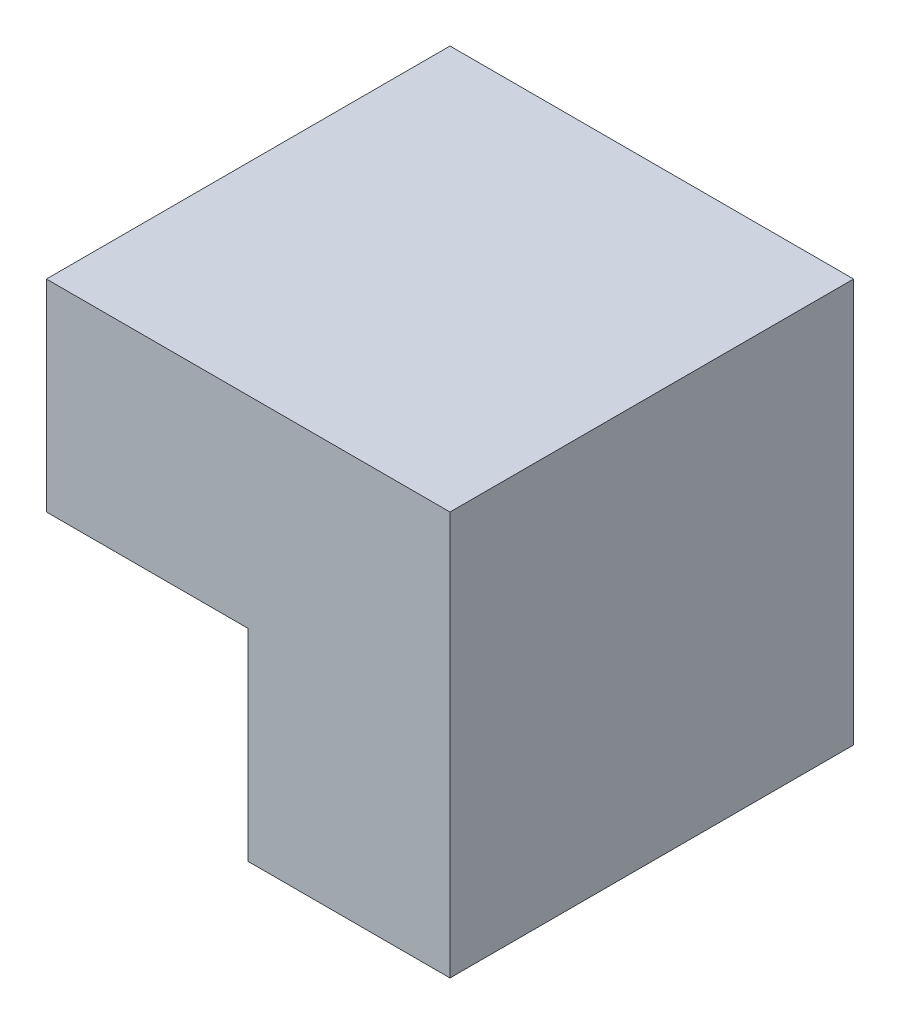
ISO-10303-21;
HEADER;
FILE_DESCRIPTION(('STEP AP214'),'2;1');
FILE_NAME('part.step','',(''),(''),'','','');
FILE_SCHEMA(('AUTOMOTIVE_DESIGN { 1 0 10303 214 1 1 1 1 }'));
ENDSEC;
DATA;
#1=APPLICATION_CONTEXT('core data for automotive mechanical design processes');
#2=APPLICATION_PROTOCOL_DEFINITION('international standard','automotive_design',2000,#1);
#3=PRODUCT_CONTEXT('',#1,'mechanical');
#4=PRODUCT('Part','Part','',(#3));
#5=PRODUCT_RELATED_PRODUCT_CATEGORY('part','',(#4));
#6=PRODUCT_DEFINITION_FORMATION('','',#4);
#7=PRODUCT_DEFINITION_CONTEXT('part definition',#1,'design');
#8=PRODUCT_DEFINITION('design','',#6,#7);
#9=PRODUCT_DEFINITION_SHAPE('','',#8);
#10=(LENGTH_UNIT() NAMED_UNIT(*) SI_UNIT(.MILLI.,.METRE.));
#11=(NAMED_UNIT(*) PLANE_ANGLE_UNIT() SI_UNIT($,.RADIAN.));
#12=(NAMED_UNIT(*) SI_UNIT($,.STERADIAN.) SOLID_ANGLE_UNIT());
#13=UNCERTAINTY_MEASURE_WITH_UNIT(LENGTH_MEASURE(1.E-05),#10,'distance_accuracy_value','');
#14=(GEOMETRIC_REPRESENTATION_CONTEXT(3) GLOBAL_UNCERTAINTY_ASSIGNED_CONTEXT((#13)) GLOBAL_UNIT_ASSIGNED_CONTEXT((#10,
#11,#12)) REPRESENTATION_CONTEXT('',''));
#15=CARTESIAN_POINT('',(0.,0.,0.));
#16=DIRECTION('',(0.,0.,1.));
#17=DIRECTION('',(1.,0.,0.));
#18=AXIS2_PLACEMENT_3D('',#15,#16,#17);
#19=CARTESIAN_POINT('',(0.,5.,10.));
#20=DIRECTION('',(0.,1.,0.));
#21=DIRECTION('',(0.,0.,1.));
#22=AXIS2_PLACEMENT_3D('',#19,#20,#21);
#23=PLANE('',#22);
#24=DIRECTION('',(1.,0.,0.));
#25=VECTOR('',#24,1.);
#26=CARTESIAN_POINT('',(0.,5.,0.));
#27=LINE('',#26,#25);
#28=CARTESIAN_POINT('',(10.,5.,0.));
#29=VERTEX_POINT('',#28);
#30=CARTESIAN_POINT('',(15.,5.,0.));
#31=VERTEX_POINT('',#30);
#32=EDGE_CURVE('E129',#29,#31,#27,.T.);
#33=ORIENTED_EDGE('',*,*,#32,.T.);
#34=DIRECTION('',(0.,0.,-1.));
#35=VECTOR('',#34,1.);
#36=CARTESIAN_POINT('',(15.,5.,10.));
#37=LINE('',#36,#35);
#38=CARTESIAN_POINT('',(15.,5.,10.));
#39=VERTEX_POINT('',#38);
#40=EDGE_CURVE('E11',#39,#31,#37,.T.);
#41=ORIENTED_EDGE('',*,*,#40,.F.);
#42=DIRECTION('',(1.,0.,0.));
#43=VECTOR('',#42,1.);
#44=CARTESIAN_POINT('',(0.,5.,10.));
#45=LINE('',#44,#43);
#46=CARTESIAN_POINT('',(10.,5.,10.));
#47=VERTEX_POINT('',#46);
#48=EDGE_CURVE('E141',#47,#39,#45,.T.);
#49=ORIENTED_EDGE('',*,*,#48,.F.);
#50=DIRECTION('',(0.,0.,-1.));
#51=VECTOR('',#50,1.);
#52=CARTESIAN_POINT('',(10.,5.,10.));
#53=LINE('',#52,#51);
#54=EDGE_CURVE('E58',#47,#29,#53,.T.);
#55=ORIENTED_EDGE('',*,*,#54,.T.);
#56=EDGE_LOOP('',(#33,#41,#49,#55));
#57=FACE_BOUND('',#56,.T.);
#58=ADVANCED_FACE('F42',(#57),#23,.F.);
#59=CARTESIAN_POINT('',(15.,0.,10.));
#60=DIRECTION('',(-1.,0.,0.));
#61=DIRECTION('',(0.,0.,1.));
#62=AXIS2_PLACEMENT_3D('',#59,#60,#61);
#63=PLANE('',#62);
#64=DIRECTION('',(0.,1.,0.));
#65=VECTOR('',#64,1.);
#66=CARTESIAN_POINT('',(15.,0.,0.));
#67=LINE('',#66,#65);
#68=CARTESIAN_POINT('',(15.,15.,0.));
#69=VERTEX_POINT('',#68);
#70=EDGE_CURVE('E131',#31,#69,#67,.T.);
#71=ORIENTED_EDGE('',*,*,#70,.T.);
#72=DIRECTION('',(0.,0.,-1.));
#73=VECTOR('',#72,1.);
#74=CARTESIAN_POINT('',(15.,15.,10.));
#75=LINE('',#74,#73);
#76=CARTESIAN_POINT('',(15.,15.,10.));
#77=VERTEX_POINT('',#76);
#78=EDGE_CURVE('E55',#77,#69,#75,.T.);
#79=ORIENTED_EDGE('',*,*,#78,.F.);
#80=DIRECTION('',(0.,1.,0.));
#81=VECTOR('',#80,1.);
#82=CARTESIAN_POINT('',(15.,0.,10.));
#83=LINE('',#82,#81);
#84=EDGE_CURVE('E91',#39,#77,#83,.T.);
#85=ORIENTED_EDGE('',*,*,#84,.F.);
#86=ORIENTED_EDGE('',*,*,#40,.T.);
#87=EDGE_LOOP('',(#71,#79,#85,#86));
#88=FACE_BOUND('',#87,.T.);
#89=ADVANCED_FACE('F149',(#88),#63,.F.);
#90=CARTESIAN_POINT('',(0.,15.,10.));
#91=DIRECTION('',(0.,1.,0.));
#92=DIRECTION('',(0.,0.,1.));
#93=AXIS2_PLACEMENT_3D('',#90,#91,#92);
#94=PLANE('',#93);
#95=DIRECTION('',(1.,0.,0.));
#96=VECTOR('',#95,1.);
#97=CARTESIAN_POINT('',(0.,15.,0.));
#98=LINE('',#97,#96);
#99=CARTESIAN_POINT('',(5.,15.,0.));
#100=VERTEX_POINT('',#99);
#101=EDGE_CURVE('E133',#100,#69,#98,.T.);
#102=ORIENTED_EDGE('',*,*,#101,.F.);
#103=DIRECTION('',(0.,0.,-1.));
#104=VECTOR('',#103,1.);
#105=CARTESIAN_POINT('',(5.,15.,10.));
#106=LINE('',#105,#104);
#107=CARTESIAN_POINT('',(5.,15.,10.));
#108=VERTEX_POINT('',#107);
#109=EDGE_CURVE('E115',#108,#100,#106,.T.);
#110=ORIENTED_EDGE('',*,*,#109,.F.);
#111=DIRECTION('',(1.,0.,0.));
#112=VECTOR('',#111,1.);
#113=CARTESIAN_POINT('',(0.,15.,10.));
#114=LINE('',#113,#112);
#115=EDGE_CURVE('E123',#108,#77,#114,.T.);
#116=ORIENTED_EDGE('',*,*,#115,.T.);
#117=ORIENTED_EDGE('',*,*,#78,.T.);
#118=EDGE_LOOP('',(#102,#110,#116,#117));
#119=FACE_BOUND('',#118,.T.);
#120=ADVANCED_FACE('F146',(#119),#94,.T.);
#121=CARTESIAN_POINT('',(5.,0.,10.));
#122=DIRECTION('',(-1.,0.,0.));
#123=DIRECTION('',(0.,0.,1.));
#124=AXIS2_PLACEMENT_3D('',#121,#122,#123);
#125=PLANE('',#124);
#126=DIRECTION('',(0.,1.,0.));
#127=VECTOR('',#126,1.);
#128=CARTESIAN_POINT('',(5.,0.,0.));
#129=LINE('',#128,#127);
#130=CARTESIAN_POINT('',(5.,10.,0.));
#131=VERTEX_POINT('',#130);
#132=EDGE_CURVE('E108',#131,#100,#129,.T.);
#133=ORIENTED_EDGE('',*,*,#132,.F.);
#134=DIRECTION('',(0.,0.,-1.));
#135=VECTOR('',#134,1.);
#136=CARTESIAN_POINT('',(5.,10.,10.));
#137=LINE('',#136,#135);
#138=CARTESIAN_POINT('',(5.,10.,10.));
#139=VERTEX_POINT('',#138);
#140=EDGE_CURVE('E103',#139,#131,#137,.T.);
#141=ORIENTED_EDGE('',*,*,#140,.F.);
#142=DIRECTION('',(0.,1.,0.));
#143=VECTOR('',#142,1.);
#144=CARTESIAN_POINT('',(5.,0.,10.));
#145=LINE('',#144,#143);
#146=EDGE_CURVE('E110',#139,#108,#145,.T.);
#147=ORIENTED_EDGE('',*,*,#146,.T.);
#148=ORIENTED_EDGE('',*,*,#109,.T.);
#149=EDGE_LOOP('',(#133,#141,#147,#148));
#150=FACE_BOUND('',#149,.T.);
#151=ADVANCED_FACE('F104',(#150),#125,.T.);
#152=CARTESIAN_POINT('',(0.,10.,10.));
#153=DIRECTION('',(0.,1.,0.));
#154=DIRECTION('',(0.,0.,1.));
#155=AXIS2_PLACEMENT_3D('',#152,#153,#154);
#156=PLANE('',#155);
#157=DIRECTION('',(1.,0.,0.));
#158=VECTOR('',#157,1.);
#159=CARTESIAN_POINT('',(0.,10.,0.));
#160=LINE('',#159,#158);
#161=CARTESIAN_POINT('',(10.,10.,0.));
#162=VERTEX_POINT('',#161);
#163=EDGE_CURVE('E138',#131,#162,#160,.T.);
#164=ORIENTED_EDGE('',*,*,#163,.T.);
#165=DIRECTION('',(0.,0.,-1.));
#166=VECTOR('',#165,1.);
#167=CARTESIAN_POINT('',(10.,10.,10.));
#168=LINE('',#167,#166);
#169=CARTESIAN_POINT('',(10.,10.,10.));
#170=VERTEX_POINT('',#169);
#171=EDGE_CURVE('E82',#170,#162,#168,.T.);
#172=ORIENTED_EDGE('',*,*,#171,.F.);
#173=DIRECTION('',(1.,0.,0.));
#174=VECTOR('',#173,1.);
#175=CARTESIAN_POINT('',(0.,10.,10.));
#176=LINE('',#175,#174);
#177=EDGE_CURVE('E111',#139,#170,#176,.T.);
#178=ORIENTED_EDGE('',*,*,#177,.F.);
#179=ORIENTED_EDGE('',*,*,#140,.T.);
#180=EDGE_LOOP('',(#164,#172,#178,#179));
#181=FACE_BOUND('',#180,.T.);
#182=ADVANCED_FACE('F113',(#181),#156,.F.);
#183=CARTESIAN_POINT('',(10.,0.,10.));
#184=DIRECTION('',(-1.,0.,0.));
#185=DIRECTION('',(0.,0.,1.));
#186=AXIS2_PLACEMENT_3D('',#183,#184,#185);
#187=PLANE('',#186);
#188=DIRECTION('',(0.,1.,0.));
#189=VECTOR('',#188,1.);
#190=CARTESIAN_POINT('',(10.,0.,0.));
#191=LINE('',#190,#189);
#192=EDGE_CURVE('E136',#29,#162,#191,.T.);
#193=ORIENTED_EDGE('',*,*,#192,.F.);
#194=ORIENTED_EDGE('',*,*,#54,.F.);
#195=DIRECTION('',(0.,1.,0.));
#196=VECTOR('',#195,1.);
#197=CARTESIAN_POINT('',(10.,0.,10.));
#198=LINE('',#197,#196);
#199=EDGE_CURVE('E117',#47,#170,#198,.T.);
#200=ORIENTED_EDGE('',*,*,#199,.T.);
#201=ORIENTED_EDGE('',*,*,#171,.T.);
#202=EDGE_LOOP('',(#193,#194,#200,#201));
#203=FACE_BOUND('',#202,.T.);
#204=ADVANCED_FACE('F153',(#203),#187,.T.);
#205=CARTESIAN_POINT('',(0.,0.,10.));
#206=DIRECTION('',(0.,0.,1.));
#207=DIRECTION('',(1.,0.,0.));
#208=AXIS2_PLACEMENT_3D('',#205,#206,#207);
#209=PLANE('',#208);
#210=ORIENTED_EDGE('',*,*,#48,.T.);
#211=ORIENTED_EDGE('',*,*,#84,.T.);
#212=ORIENTED_EDGE('',*,*,#115,.F.);
#213=ORIENTED_EDGE('',*,*,#146,.F.);
#214=ORIENTED_EDGE('',*,*,#177,.T.);
#215=ORIENTED_EDGE('',*,*,#199,.F.);
#216=EDGE_LOOP('',(#210,#211,#212,#213,#214,#215));
#217=FACE_BOUND('',#216,.T.);
#218=ADVANCED_FACE('F121',(#217),#209,.T.);
#219=CARTESIAN_POINT('',(0.,0.,0.));
#220=DIRECTION('',(0.,0.,1.));
#221=DIRECTION('',(1.,0.,0.));
#222=AXIS2_PLACEMENT_3D('',#219,#220,#221);
#223=PLANE('',#222);
#224=ORIENTED_EDGE('',*,*,#32,.F.);
#225=ORIENTED_EDGE('',*,*,#192,.T.);
#226=ORIENTED_EDGE('',*,*,#163,.F.);
#227=ORIENTED_EDGE('',*,*,#132,.T.);
#228=ORIENTED_EDGE('',*,*,#101,.T.);
#229=ORIENTED_EDGE('',*,*,#70,.F.);
#230=EDGE_LOOP('',(#224,#225,#226,#227,#228,#229));
#231=FACE_BOUND('',#230,.T.);
#232=ADVANCED_FACE('F155',(#231),#223,.F.);
#233=CLOSED_SHELL('',(#58,#89,#120,#151,#182,#204,#218,#232));
#234=MANIFOLD_SOLID_BREP('B2',#233);
#235=ADVANCED_BREP_SHAPE_REPRESENTATION('',(#18,#234),#14);
#236=SHAPE_DEFINITION_REPRESENTATION(#9,#235);
ENDSEC;
END-ISO-10303-21;
